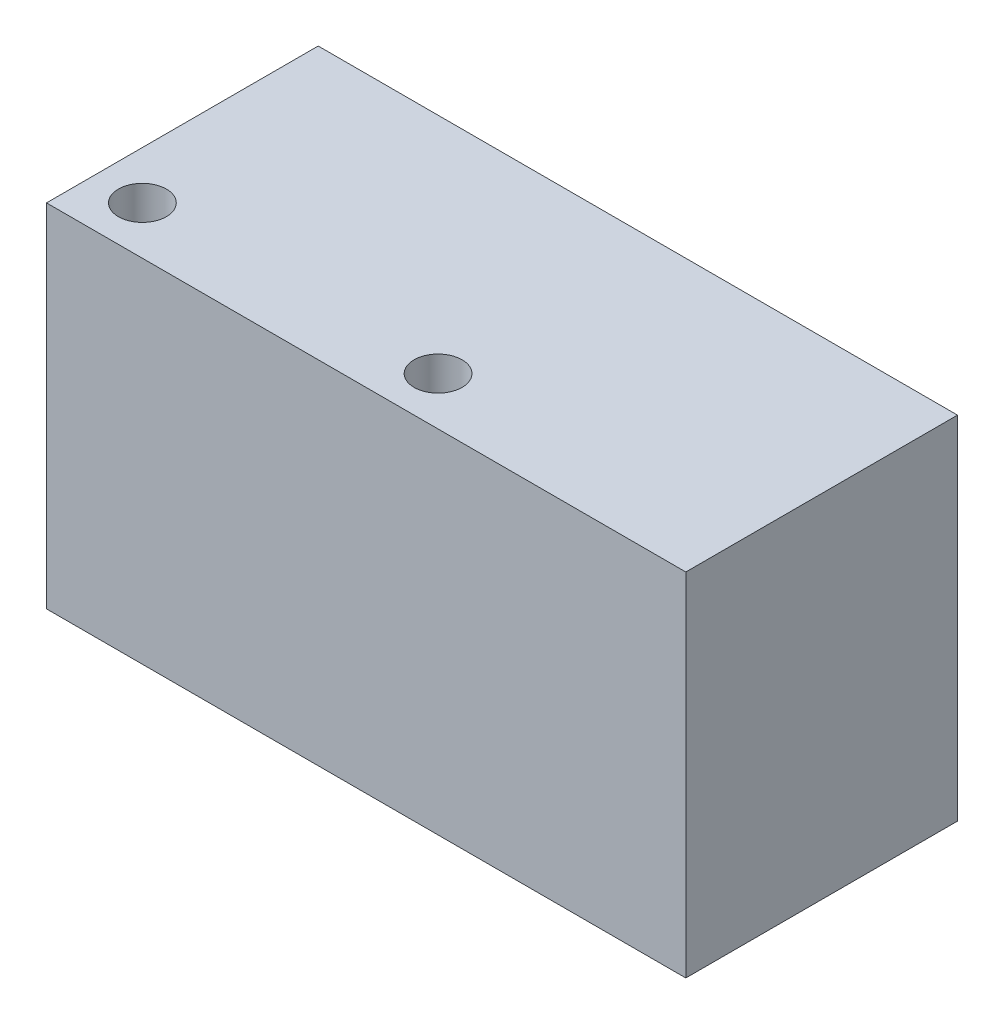
ISO-10303-21;
HEADER;
FILE_DESCRIPTION(('STEP AP214'),'2;1');
FILE_NAME('part.step','',(''),(''),'','','');
FILE_SCHEMA(('AUTOMOTIVE_DESIGN { 1 0 10303 214 1 1 1 1 }'));
ENDSEC;
DATA;
#1=APPLICATION_CONTEXT('core data for automotive mechanical design processes');
#2=APPLICATION_PROTOCOL_DEFINITION('international standard','automotive_design',2000,#1);
#3=PRODUCT_CONTEXT('',#1,'mechanical');
#4=PRODUCT('Part','Part','',(#3));
#5=PRODUCT_RELATED_PRODUCT_CATEGORY('part','',(#4));
#6=PRODUCT_DEFINITION_FORMATION('','',#4);
#7=PRODUCT_DEFINITION_CONTEXT('part definition',#1,'design');
#8=PRODUCT_DEFINITION('design','',#6,#7);
#9=PRODUCT_DEFINITION_SHAPE('','',#8);
#10=(LENGTH_UNIT() NAMED_UNIT(*) SI_UNIT(.MILLI.,.METRE.));
#11=(NAMED_UNIT(*) PLANE_ANGLE_UNIT() SI_UNIT($,.RADIAN.));
#12=(NAMED_UNIT(*) SI_UNIT($,.STERADIAN.) SOLID_ANGLE_UNIT());
#13=UNCERTAINTY_MEASURE_WITH_UNIT(LENGTH_MEASURE(1.E-05),#10,'distance_accuracy_value','');
#14=(GEOMETRIC_REPRESENTATION_CONTEXT(3) GLOBAL_UNCERTAINTY_ASSIGNED_CONTEXT((#13)) GLOBAL_UNIT_ASSIGNED_CONTEXT((#10,
#11,#12)) REPRESENTATION_CONTEXT('',''));
#15=CARTESIAN_POINT('',(0.,0.,0.));
#16=DIRECTION('',(0.,0.,1.));
#17=DIRECTION('',(1.,0.,0.));
#18=AXIS2_PLACEMENT_3D('',#15,#16,#17);
#19=CARTESIAN_POINT('',(20.,22.,-8.5));
#20=DIRECTION('',(-1.,0.,0.));
#21=DIRECTION('',(0.,0.,1.));
#22=AXIS2_PLACEMENT_3D('',#19,#20,#21);
#23=PLANE('',#22);
#24=DIRECTION('',(0.,0.,-1.));
#25=VECTOR('',#24,1.);
#26=CARTESIAN_POINT('',(20.,0.,-8.5));
#27=LINE('',#26,#25);
#28=CARTESIAN_POINT('',(20.,0.,8.5));
#29=VERTEX_POINT('',#28);
#30=CARTESIAN_POINT('',(20.,0.,-8.5));
#31=VERTEX_POINT('',#30);
#32=EDGE_CURVE('E107',#29,#31,#27,.T.);
#33=ORIENTED_EDGE('',*,*,#32,.T.);
#34=DIRECTION('',(0.,-1.,0.));
#35=VECTOR('',#34,1.);
#36=CARTESIAN_POINT('',(20.,22.,-8.5));
#37=LINE('',#36,#35);
#38=CARTESIAN_POINT('',(20.,22.,-8.5));
#39=VERTEX_POINT('',#38);
#40=EDGE_CURVE('E11',#39,#31,#37,.T.);
#41=ORIENTED_EDGE('',*,*,#40,.F.);
#42=DIRECTION('',(0.,0.,-1.));
#43=VECTOR('',#42,1.);
#44=CARTESIAN_POINT('',(20.,22.,-8.5));
#45=LINE('',#44,#43);
#46=CARTESIAN_POINT('',(20.,22.,8.5));
#47=VERTEX_POINT('',#46);
#48=EDGE_CURVE('E91',#47,#39,#45,.T.);
#49=ORIENTED_EDGE('',*,*,#48,.F.);
#50=DIRECTION('',(0.,-1.,0.));
#51=VECTOR('',#50,1.);
#52=CARTESIAN_POINT('',(20.,22.,8.5));
#53=LINE('',#52,#51);
#54=EDGE_CURVE('E103',#47,#29,#53,.T.);
#55=ORIENTED_EDGE('',*,*,#54,.T.);
#56=EDGE_LOOP('',(#33,#41,#49,#55));
#57=FACE_BOUND('',#56,.T.);
#58=ADVANCED_FACE('F39',(#57),#23,.F.);
#59=CARTESIAN_POINT('',(-20.,22.,-8.5));
#60=DIRECTION('',(0.,0.,1.));
#61=DIRECTION('',(1.,0.,0.));
#62=AXIS2_PLACEMENT_3D('',#59,#60,#61);
#63=PLANE('',#62);
#64=DIRECTION('',(-1.,0.,0.));
#65=VECTOR('',#64,1.);
#66=CARTESIAN_POINT('',(-20.,0.,-8.5));
#67=LINE('',#66,#65);
#68=CARTESIAN_POINT('',(-20.,0.,-8.5));
#69=VERTEX_POINT('',#68);
#70=EDGE_CURVE('E96',#31,#69,#67,.T.);
#71=ORIENTED_EDGE('',*,*,#70,.T.);
#72=DIRECTION('',(0.,-1.,0.));
#73=VECTOR('',#72,1.);
#74=CARTESIAN_POINT('',(-20.,22.,-8.5));
#75=LINE('',#74,#73);
#76=CARTESIAN_POINT('',(-20.,22.,-8.5));
#77=VERTEX_POINT('',#76);
#78=EDGE_CURVE('E48',#77,#69,#75,.T.);
#79=ORIENTED_EDGE('',*,*,#78,.F.);
#80=DIRECTION('',(-1.,0.,0.));
#81=VECTOR('',#80,1.);
#82=CARTESIAN_POINT('',(-20.,22.,-8.5));
#83=LINE('',#82,#81);
#84=EDGE_CURVE('E86',#39,#77,#83,.T.);
#85=ORIENTED_EDGE('',*,*,#84,.F.);
#86=ORIENTED_EDGE('',*,*,#40,.T.);
#87=EDGE_LOOP('',(#71,#79,#85,#86));
#88=FACE_BOUND('',#87,.T.);
#89=ADVANCED_FACE('F95',(#88),#63,.F.);
#90=CARTESIAN_POINT('',(-20.,22.,-8.5));
#91=DIRECTION('',(1.,0.,0.));
#92=DIRECTION('',(0.,0.,-1.));
#93=AXIS2_PLACEMENT_3D('',#90,#91,#92);
#94=PLANE('',#93);
#95=DIRECTION('',(0.,0.,1.));
#96=VECTOR('',#95,1.);
#97=CARTESIAN_POINT('',(-20.,0.,-8.5));
#98=LINE('',#97,#96);
#99=CARTESIAN_POINT('',(-20.,0.,8.5));
#100=VERTEX_POINT('',#99);
#101=EDGE_CURVE('E73',#69,#100,#98,.T.);
#102=ORIENTED_EDGE('',*,*,#101,.T.);
#103=DIRECTION('',(0.,-1.,0.));
#104=VECTOR('',#103,1.);
#105=CARTESIAN_POINT('',(-20.,22.,8.5));
#106=LINE('',#105,#104);
#107=CARTESIAN_POINT('',(-20.,22.,8.5));
#108=VERTEX_POINT('',#107);
#109=EDGE_CURVE('E98',#108,#100,#106,.T.);
#110=ORIENTED_EDGE('',*,*,#109,.F.);
#111=DIRECTION('',(0.,0.,1.));
#112=VECTOR('',#111,1.);
#113=CARTESIAN_POINT('',(-20.,22.,-8.5));
#114=LINE('',#113,#112);
#115=EDGE_CURVE('E89',#77,#108,#114,.T.);
#116=ORIENTED_EDGE('',*,*,#115,.F.);
#117=ORIENTED_EDGE('',*,*,#78,.T.);
#118=EDGE_LOOP('',(#102,#110,#116,#117));
#119=FACE_BOUND('',#118,.T.);
#120=ADVANCED_FACE('F99',(#119),#94,.F.);
#121=CARTESIAN_POINT('',(-20.,22.,8.5));
#122=DIRECTION('',(0.,0.,-1.));
#123=DIRECTION('',(-1.,0.,0.));
#124=AXIS2_PLACEMENT_3D('',#121,#122,#123);
#125=PLANE('',#124);
#126=DIRECTION('',(1.,0.,0.));
#127=VECTOR('',#126,1.);
#128=CARTESIAN_POINT('',(-20.,0.,8.5));
#129=LINE('',#128,#127);
#130=EDGE_CURVE('E79',#100,#29,#129,.T.);
#131=ORIENTED_EDGE('',*,*,#130,.T.);
#132=ORIENTED_EDGE('',*,*,#54,.F.);
#133=DIRECTION('',(1.,0.,0.));
#134=VECTOR('',#133,1.);
#135=CARTESIAN_POINT('',(-20.,22.,8.5));
#136=LINE('',#135,#134);
#137=EDGE_CURVE('E56',#108,#47,#136,.T.);
#138=ORIENTED_EDGE('',*,*,#137,.F.);
#139=ORIENTED_EDGE('',*,*,#109,.T.);
#140=EDGE_LOOP('',(#131,#132,#138,#139));
#141=FACE_BOUND('',#140,.T.);
#142=ADVANCED_FACE('F121',(#141),#125,.F.);
#143=CARTESIAN_POINT('',(0.,22.,0.));
#144=DIRECTION('',(0.,1.,0.));
#145=DIRECTION('',(0.,0.,1.));
#146=AXIS2_PLACEMENT_3D('',#143,#144,#145);
#147=PLANE('',#146);
#148=CARTESIAN_POINT('',(1.5,22.,5.5));
#149=DIRECTION('',(0.,1.,0.));
#150=DIRECTION('',(0.,0.,1.));
#151=AXIS2_PLACEMENT_3D('',#148,#149,#150);
#152=CIRCLE('',#151,1.5);
#153=CARTESIAN_POINT('',(1.5,22.,7.));
#154=VERTEX_POINT('',#153);
#155=EDGE_CURVE('E136',#154,#154,#152,.T.);
#156=ORIENTED_EDGE('',*,*,#155,.F.);
#157=EDGE_LOOP('',(#156));
#158=FACE_BOUND('',#157,.T.);
#159=CARTESIAN_POINT('',(-17.,22.,5.5));
#160=DIRECTION('',(0.,1.,0.));
#161=DIRECTION('',(0.,0.,1.));
#162=AXIS2_PLACEMENT_3D('',#159,#160,#161);
#163=CIRCLE('',#162,1.5);
#164=CARTESIAN_POINT('',(-17.,22.,7.));
#165=VERTEX_POINT('',#164);
#166=EDGE_CURVE('E128',#165,#165,#163,.T.);
#167=ORIENTED_EDGE('',*,*,#166,.F.);
#168=EDGE_LOOP('',(#167));
#169=FACE_BOUND('',#168,.T.);
#170=ORIENTED_EDGE('',*,*,#48,.T.);
#171=ORIENTED_EDGE('',*,*,#84,.T.);
#172=ORIENTED_EDGE('',*,*,#115,.T.);
#173=ORIENTED_EDGE('',*,*,#137,.T.);
#174=EDGE_LOOP('',(#170,#171,#172,#173));
#175=FACE_BOUND('',#174,.T.);
#176=ADVANCED_FACE('F87',(#158,#169,#175),#147,.T.);
#177=CARTESIAN_POINT('',(0.,0.,0.));
#178=DIRECTION('',(0.,1.,0.));
#179=DIRECTION('',(0.,0.,1.));
#180=AXIS2_PLACEMENT_3D('',#177,#178,#179);
#181=PLANE('',#180);
#182=CARTESIAN_POINT('',(1.5,0.,5.5));
#183=DIRECTION('',(0.,1.,0.));
#184=DIRECTION('',(0.,0.,1.));
#185=AXIS2_PLACEMENT_3D('',#182,#183,#184);
#186=CIRCLE('',#185,1.5);
#187=CARTESIAN_POINT('',(1.5,0.,7.));
#188=VERTEX_POINT('',#187);
#189=EDGE_CURVE('E132',#188,#188,#186,.T.);
#190=ORIENTED_EDGE('',*,*,#189,.T.);
#191=EDGE_LOOP('',(#190));
#192=FACE_BOUND('',#191,.T.);
#193=CARTESIAN_POINT('',(-17.,0.,5.5));
#194=DIRECTION('',(0.,1.,0.));
#195=DIRECTION('',(0.,0.,1.));
#196=AXIS2_PLACEMENT_3D('',#193,#194,#195);
#197=CIRCLE('',#196,1.5);
#198=CARTESIAN_POINT('',(-17.,0.,7.));
#199=VERTEX_POINT('',#198);
#200=EDGE_CURVE('E111',#199,#199,#197,.T.);
#201=ORIENTED_EDGE('',*,*,#200,.T.);
#202=EDGE_LOOP('',(#201));
#203=FACE_BOUND('',#202,.T.);
#204=ORIENTED_EDGE('',*,*,#32,.F.);
#205=ORIENTED_EDGE('',*,*,#130,.F.);
#206=ORIENTED_EDGE('',*,*,#101,.F.);
#207=ORIENTED_EDGE('',*,*,#70,.F.);
#208=EDGE_LOOP('',(#204,#205,#206,#207));
#209=FACE_BOUND('',#208,.T.);
#210=ADVANCED_FACE('F124',(#192,#203,#209),#181,.F.);
#211=CARTESIAN_POINT('',(-17.,0.,5.5));
#212=DIRECTION('',(0.,1.,0.));
#213=DIRECTION('',(0.,0.,1.));
#214=AXIS2_PLACEMENT_3D('',#211,#212,#213);
#215=CYLINDRICAL_SURFACE('',#214,1.5);
#216=ORIENTED_EDGE('',*,*,#200,.F.);
#217=EDGE_LOOP('',(#216));
#218=FACE_BOUND('',#217,.T.);
#219=ORIENTED_EDGE('',*,*,#166,.T.);
#220=EDGE_LOOP('',(#219));
#221=FACE_BOUND('',#220,.T.);
#222=ADVANCED_FACE('F149',(#218,#221),#215,.F.);
#223=CARTESIAN_POINT('',(1.5,0.,5.5));
#224=DIRECTION('',(0.,1.,0.));
#225=DIRECTION('',(0.,0.,1.));
#226=AXIS2_PLACEMENT_3D('',#223,#224,#225);
#227=CYLINDRICAL_SURFACE('',#226,1.5);
#228=ORIENTED_EDGE('',*,*,#189,.F.);
#229=EDGE_LOOP('',(#228));
#230=FACE_BOUND('',#229,.T.);
#231=ORIENTED_EDGE('',*,*,#155,.T.);
#232=EDGE_LOOP('',(#231));
#233=FACE_BOUND('',#232,.T.);
#234=ADVANCED_FACE('F146',(#230,#233),#227,.F.);
#235=CLOSED_SHELL('',(#58,#89,#120,#142,#176,#210,#222,#234));
#236=MANIFOLD_SOLID_BREP('B2',#235);
#237=ADVANCED_BREP_SHAPE_REPRESENTATION('',(#18,#236),#14);
#238=SHAPE_DEFINITION_REPRESENTATION(#9,#237);
ENDSEC;
END-ISO-10303-21;
